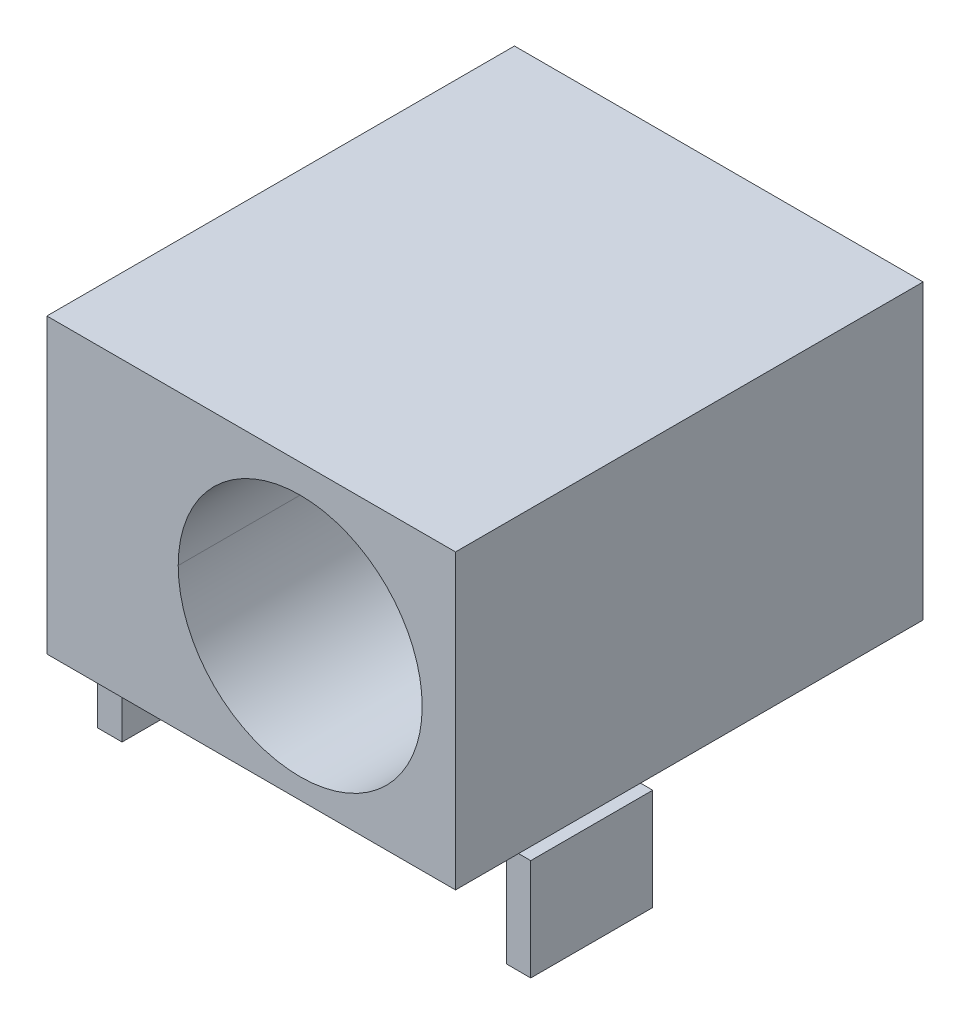
ISO-10303-21;
HEADER;
FILE_DESCRIPTION(('STEP AP214'),'2;1');
FILE_NAME('part.step','',(''),(''),'','','');
FILE_SCHEMA(('AUTOMOTIVE_DESIGN { 1 0 10303 214 1 1 1 1 }'));
ENDSEC;
DATA;
#1=APPLICATION_CONTEXT('core data for automotive mechanical design processes');
#2=APPLICATION_PROTOCOL_DEFINITION('international standard','automotive_design',2000,#1);
#3=PRODUCT_CONTEXT('',#1,'mechanical');
#4=PRODUCT('Part','Part','',(#3));
#5=PRODUCT_RELATED_PRODUCT_CATEGORY('part','',(#4));
#6=PRODUCT_DEFINITION_FORMATION('','',#4);
#7=PRODUCT_DEFINITION_CONTEXT('part definition',#1,'design');
#8=PRODUCT_DEFINITION('design','',#6,#7);
#9=PRODUCT_DEFINITION_SHAPE('','',#8);
#10=(LENGTH_UNIT() NAMED_UNIT(*) SI_UNIT(.MILLI.,.METRE.));
#11=(NAMED_UNIT(*) PLANE_ANGLE_UNIT() SI_UNIT($,.RADIAN.));
#12=(NAMED_UNIT(*) SI_UNIT($,.STERADIAN.) SOLID_ANGLE_UNIT());
#13=UNCERTAINTY_MEASURE_WITH_UNIT(LENGTH_MEASURE(1.E-05),#10,'distance_accuracy_value','');
#14=(GEOMETRIC_REPRESENTATION_CONTEXT(3) GLOBAL_UNCERTAINTY_ASSIGNED_CONTEXT((#13)) GLOBAL_UNIT_ASSIGNED_CONTEXT((#10,
#11,#12)) REPRESENTATION_CONTEXT('',''));
#15=CARTESIAN_POINT('',(0.,0.,0.));
#16=DIRECTION('',(0.,0.,1.));
#17=DIRECTION('',(1.,0.,0.));
#18=AXIS2_PLACEMENT_3D('',#15,#16,#17);
#19=CARTESIAN_POINT('',(0.,0.,-2.45));
#20=DIRECTION('',(0.,0.,-1.));
#21=DIRECTION('',(0.,-1.,0.));
#22=AXIS2_PLACEMENT_3D('',#19,#20,#21);
#23=PLANE('',#22);
#24=CARTESIAN_POINT('',(1.205,3.5,-2.45));
#25=DIRECTION('',(0.,0.,1.));
#26=DIRECTION('',(1.,0.,0.));
#27=AXIS2_PLACEMENT_3D('',#24,#25,#26);
#28=CIRCLE('',#27,3.);
#29=CARTESIAN_POINT('',(-1.795,3.5,-2.45));
#30=VERTEX_POINT('',#29);
#31=CARTESIAN_POINT('',(4.205,3.5,-2.45));
#32=VERTEX_POINT('',#31);
#33=EDGE_CURVE('E274',#30,#32,#28,.T.);
#34=ORIENTED_EDGE('',*,*,#33,.T.);
#35=CARTESIAN_POINT('',(1.205,3.5,-2.45));
#36=DIRECTION('',(0.,0.,1.));
#37=DIRECTION('',(1.,0.,0.));
#38=AXIS2_PLACEMENT_3D('',#35,#36,#37);
#39=CIRCLE('',#38,3.);
#40=EDGE_CURVE('E11',#32,#30,#39,.T.);
#41=ORIENTED_EDGE('',*,*,#40,.T.);
#42=EDGE_LOOP('',(#34,#41));
#43=FACE_BOUND('',#42,.T.);
#44=ADVANCED_FACE('F16',(#43),#23,.F.);
#45=CARTESIAN_POINT('',(1.205,3.5,5.75));
#46=DIRECTION('',(0.,0.,-1.));
#47=DIRECTION('',(-1.,0.,0.));
#48=AXIS2_PLACEMENT_3D('',#45,#46,#47);
#49=CYLINDRICAL_SURFACE('',#48,3.);
#50=DIRECTION('',(0.,0.,-1.));
#51=VECTOR('',#50,1.);
#52=CARTESIAN_POINT('',(4.205,3.5,5.75));
#53=LINE('',#52,#51);
#54=CARTESIAN_POINT('',(4.205,3.5,5.75));
#55=VERTEX_POINT('',#54);
#56=EDGE_CURVE('E279',#55,#32,#53,.T.);
#57=ORIENTED_EDGE('',*,*,#56,.F.);
#58=CARTESIAN_POINT('',(1.205,3.5,5.75));
#59=DIRECTION('',(0.,0.,1.));
#60=DIRECTION('',(1.,0.,0.));
#61=AXIS2_PLACEMENT_3D('',#58,#59,#60);
#62=CIRCLE('',#61,3.);
#63=CARTESIAN_POINT('',(-1.795,3.5,5.75));
#64=VERTEX_POINT('',#63);
#65=EDGE_CURVE('E222',#55,#64,#62,.T.);
#66=ORIENTED_EDGE('',*,*,#65,.T.);
#67=DIRECTION('',(0.,0.,-1.));
#68=VECTOR('',#67,1.);
#69=CARTESIAN_POINT('',(-1.795,3.5,5.75));
#70=LINE('',#69,#68);
#71=EDGE_CURVE('E278',#64,#30,#70,.T.);
#72=ORIENTED_EDGE('',*,*,#71,.T.);
#73=ORIENTED_EDGE('',*,*,#40,.F.);
#74=EDGE_LOOP('',(#57,#66,#72,#73));
#75=FACE_BOUND('',#74,.T.);
#76=ADVANCED_FACE('F409',(#75),#49,.F.);
#77=CARTESIAN_POINT('',(0.,0.,0.));
#78=DIRECTION('',(0.,1.,0.));
#79=DIRECTION('',(1.,0.,0.));
#80=AXIS2_PLACEMENT_3D('',#77,#78,#79);
#81=PLANE('',#80);
#82=DIRECTION('',(1.,0.,0.));
#83=VECTOR('',#82,1.);
#84=CARTESIAN_POINT('',(0.,0.,1.2));
#85=LINE('',#84,#83);
#86=CARTESIAN_POINT('',(5.025,0.,1.2));
#87=VERTEX_POINT('',#86);
#88=CARTESIAN_POINT('',(5.325,0.,1.2));
#89=VERTEX_POINT('',#88);
#90=EDGE_CURVE('E101',#87,#89,#85,.T.);
#91=ORIENTED_EDGE('',*,*,#90,.F.);
#92=DIRECTION('',(0.,0.,1.));
#93=VECTOR('',#92,1.);
#94=CARTESIAN_POINT('',(5.025,0.,0.));
#95=LINE('',#94,#93);
#96=CARTESIAN_POINT('',(5.025,0.,4.2));
#97=VERTEX_POINT('',#96);
#98=EDGE_CURVE('E249',#87,#97,#95,.T.);
#99=ORIENTED_EDGE('',*,*,#98,.T.);
#100=DIRECTION('',(1.,0.,0.));
#101=VECTOR('',#100,1.);
#102=CARTESIAN_POINT('',(0.,0.,4.2));
#103=LINE('',#102,#101);
#104=CARTESIAN_POINT('',(5.325,0.,4.2));
#105=VERTEX_POINT('',#104);
#106=EDGE_CURVE('E27',#97,#105,#103,.T.);
#107=ORIENTED_EDGE('',*,*,#106,.T.);
#108=DIRECTION('',(0.,0.,1.));
#109=VECTOR('',#108,1.);
#110=CARTESIAN_POINT('',(5.325,0.,0.));
#111=LINE('',#110,#109);
#112=EDGE_CURVE('E298',#89,#105,#111,.T.);
#113=ORIENTED_EDGE('',*,*,#112,.F.);
#114=EDGE_LOOP('',(#91,#99,#107,#113));
#115=FACE_BOUND('',#114,.T.);
#116=ADVANCED_FACE('F384',(#115),#81,.T.);
#117=CARTESIAN_POINT('',(0.,-2.5,0.));
#118=DIRECTION('',(0.,1.,0.));
#119=DIRECTION('',(1.,0.,0.));
#120=AXIS2_PLACEMENT_3D('',#117,#118,#119);
#121=PLANE('',#120);
#122=DIRECTION('',(0.,0.,1.));
#123=VECTOR('',#122,1.);
#124=CARTESIAN_POINT('',(4.725,-2.5,0.));
#125=LINE('',#124,#123);
#126=CARTESIAN_POINT('',(4.725,-2.5,1.2));
#127=VERTEX_POINT('',#126);
#128=CARTESIAN_POINT('',(4.725,-2.5,4.2));
#129=VERTEX_POINT('',#128);
#130=EDGE_CURVE('E248',#127,#129,#125,.T.);
#131=ORIENTED_EDGE('',*,*,#130,.F.);
#132=DIRECTION('',(1.,0.,0.));
#133=VECTOR('',#132,1.);
#134=CARTESIAN_POINT('',(0.,-2.5,1.2));
#135=LINE('',#134,#133);
#136=CARTESIAN_POINT('',(5.325,-2.5,1.2));
#137=VERTEX_POINT('',#136);
#138=EDGE_CURVE('E294',#127,#137,#135,.T.);
#139=ORIENTED_EDGE('',*,*,#138,.T.);
#140=DIRECTION('',(0.,0.,1.));
#141=VECTOR('',#140,1.);
#142=CARTESIAN_POINT('',(5.325,-2.5,0.));
#143=LINE('',#142,#141);
#144=CARTESIAN_POINT('',(5.325,-2.5,4.2));
#145=VERTEX_POINT('',#144);
#146=EDGE_CURVE('E303',#137,#145,#143,.T.);
#147=ORIENTED_EDGE('',*,*,#146,.T.);
#148=DIRECTION('',(1.,0.,0.));
#149=VECTOR('',#148,1.);
#150=CARTESIAN_POINT('',(0.,-2.5,4.2));
#151=LINE('',#150,#149);
#152=EDGE_CURVE('E41',#129,#145,#151,.T.);
#153=ORIENTED_EDGE('',*,*,#152,.F.);
#154=EDGE_LOOP('',(#131,#139,#147,#153));
#155=FACE_BOUND('',#154,.T.);
#156=ADVANCED_FACE('F400',(#155),#121,.F.);
#157=CARTESIAN_POINT('',(0.,-2.5,4.2));
#158=DIRECTION('',(0.,0.,1.));
#159=DIRECTION('',(1.,0.,0.));
#160=AXIS2_PLACEMENT_3D('',#157,#158,#159);
#161=PLANE('',#160);
#162=DIRECTION('',(1.,0.,0.));
#163=VECTOR('',#162,1.);
#164=CARTESIAN_POINT('',(0.,0.,4.2));
#165=LINE('',#164,#163);
#166=CARTESIAN_POINT('',(4.725,0.,4.2));
#167=VERTEX_POINT('',#166);
#168=EDGE_CURVE('E256',#167,#97,#165,.T.);
#169=ORIENTED_EDGE('',*,*,#168,.F.);
#170=DIRECTION('',(0.,1.,0.));
#171=VECTOR('',#170,1.);
#172=CARTESIAN_POINT('',(4.725,-2.5,4.2));
#173=LINE('',#172,#171);
#174=EDGE_CURVE('E87',#129,#167,#173,.T.);
#175=ORIENTED_EDGE('',*,*,#174,.F.);
#176=ORIENTED_EDGE('',*,*,#152,.T.);
#177=DIRECTION('',(0.,1.,0.));
#178=VECTOR('',#177,1.);
#179=CARTESIAN_POINT('',(5.325,-2.5,4.2));
#180=LINE('',#179,#178);
#181=EDGE_CURVE('E302',#145,#105,#180,.T.);
#182=ORIENTED_EDGE('',*,*,#181,.T.);
#183=ORIENTED_EDGE('',*,*,#106,.F.);
#184=EDGE_LOOP('',(#169,#175,#176,#182,#183));
#185=FACE_BOUND('',#184,.T.);
#186=ADVANCED_FACE('F387',(#185),#161,.T.);
#187=CARTESIAN_POINT('',(5.325,-2.5,0.));
#188=DIRECTION('',(-1.,0.,0.));
#189=DIRECTION('',(0.,0.,1.));
#190=AXIS2_PLACEMENT_3D('',#187,#188,#189);
#191=PLANE('',#190);
#192=ORIENTED_EDGE('',*,*,#112,.T.);
#193=ORIENTED_EDGE('',*,*,#181,.F.);
#194=ORIENTED_EDGE('',*,*,#146,.F.);
#195=DIRECTION('',(0.,1.,0.));
#196=VECTOR('',#195,1.);
#197=CARTESIAN_POINT('',(5.325,-2.5,1.2));
#198=LINE('',#197,#196);
#199=EDGE_CURVE('E251',#137,#89,#198,.T.);
#200=ORIENTED_EDGE('',*,*,#199,.T.);
#201=EDGE_LOOP('',(#192,#193,#194,#200));
#202=FACE_BOUND('',#201,.T.);
#203=ADVANCED_FACE('F389',(#202),#191,.F.);
#204=CARTESIAN_POINT('',(0.,-2.5,1.2));
#205=DIRECTION('',(0.,0.,1.));
#206=DIRECTION('',(1.,0.,0.));
#207=AXIS2_PLACEMENT_3D('',#204,#205,#206);
#208=PLANE('',#207);
#209=DIRECTION('',(1.,0.,0.));
#210=VECTOR('',#209,1.);
#211=CARTESIAN_POINT('',(0.,0.,1.2));
#212=LINE('',#211,#210);
#213=CARTESIAN_POINT('',(4.725,0.,1.2));
#214=VERTEX_POINT('',#213);
#215=EDGE_CURVE('E280',#214,#87,#212,.T.);
#216=ORIENTED_EDGE('',*,*,#215,.T.);
#217=ORIENTED_EDGE('',*,*,#90,.T.);
#218=ORIENTED_EDGE('',*,*,#199,.F.);
#219=ORIENTED_EDGE('',*,*,#138,.F.);
#220=DIRECTION('',(0.,1.,0.));
#221=VECTOR('',#220,1.);
#222=CARTESIAN_POINT('',(4.725,-2.5,1.2));
#223=LINE('',#222,#221);
#224=EDGE_CURVE('E245',#127,#214,#223,.T.);
#225=ORIENTED_EDGE('',*,*,#224,.T.);
#226=EDGE_LOOP('',(#216,#217,#218,#219,#225));
#227=FACE_BOUND('',#226,.T.);
#228=ADVANCED_FACE('F392',(#227),#208,.F.);
#229=CARTESIAN_POINT('',(4.725,-2.5,0.));
#230=DIRECTION('',(-1.,0.,0.));
#231=DIRECTION('',(0.,0.,1.));
#232=AXIS2_PLACEMENT_3D('',#229,#230,#231);
#233=PLANE('',#232);
#234=DIRECTION('',(0.,0.,1.));
#235=VECTOR('',#234,1.);
#236=CARTESIAN_POINT('',(4.725,0.,0.));
#237=LINE('',#236,#235);
#238=EDGE_CURVE('E283',#214,#167,#237,.T.);
#239=ORIENTED_EDGE('',*,*,#238,.F.);
#240=ORIENTED_EDGE('',*,*,#224,.F.);
#241=ORIENTED_EDGE('',*,*,#130,.T.);
#242=ORIENTED_EDGE('',*,*,#174,.T.);
#243=EDGE_LOOP('',(#239,#240,#241,#242));
#244=FACE_BOUND('',#243,.T.);
#245=ADVANCED_FACE('F398',(#244),#233,.T.);
#246=CARTESIAN_POINT('',(0.,7.2,0.));
#247=DIRECTION('',(0.,1.,0.));
#248=DIRECTION('',(1.,0.,0.));
#249=AXIS2_PLACEMENT_3D('',#246,#247,#248);
#250=PLANE('',#249);
#251=DIRECTION('',(1.,0.,0.));
#252=VECTOR('',#251,1.);
#253=CARTESIAN_POINT('',(0.,7.2,-5.75));
#254=LINE('',#253,#252);
#255=CARTESIAN_POINT('',(-5.025,7.2,-5.75));
#256=VERTEX_POINT('',#255);
#257=CARTESIAN_POINT('',(5.025,7.2,-5.75));
#258=VERTEX_POINT('',#257);
#259=EDGE_CURVE('E234',#256,#258,#254,.T.);
#260=ORIENTED_EDGE('',*,*,#259,.F.);
#261=DIRECTION('',(0.,0.,1.));
#262=VECTOR('',#261,1.);
#263=CARTESIAN_POINT('',(-5.025,7.2,0.));
#264=LINE('',#263,#262);
#265=CARTESIAN_POINT('',(-5.025,7.2,5.75));
#266=VERTEX_POINT('',#265);
#267=EDGE_CURVE('E225',#256,#266,#264,.T.);
#268=ORIENTED_EDGE('',*,*,#267,.T.);
#269=DIRECTION('',(1.,0.,0.));
#270=VECTOR('',#269,1.);
#271=CARTESIAN_POINT('',(0.,7.2,5.75));
#272=LINE('',#271,#270);
#273=CARTESIAN_POINT('',(5.025,7.2,5.75));
#274=VERTEX_POINT('',#273);
#275=EDGE_CURVE('E270',#266,#274,#272,.T.);
#276=ORIENTED_EDGE('',*,*,#275,.T.);
#277=DIRECTION('',(0.,0.,1.));
#278=VECTOR('',#277,1.);
#279=CARTESIAN_POINT('',(5.025,7.2,0.));
#280=LINE('',#279,#278);
#281=EDGE_CURVE('E271',#258,#274,#280,.T.);
#282=ORIENTED_EDGE('',*,*,#281,.F.);
#283=EDGE_LOOP('',(#260,#268,#276,#282));
#284=FACE_BOUND('',#283,.T.);
#285=ADVANCED_FACE('F421',(#284),#250,.T.);
#286=CARTESIAN_POINT('',(5.025,7.2,0.));
#287=DIRECTION('',(1.,0.,0.));
#288=DIRECTION('',(0.,0.,-1.));
#289=AXIS2_PLACEMENT_3D('',#286,#287,#288);
#290=PLANE('',#289);
#291=DIRECTION('',(0.,0.,1.));
#292=VECTOR('',#291,1.);
#293=CARTESIAN_POINT('',(5.025,0.,0.));
#294=LINE('',#293,#292);
#295=CARTESIAN_POINT('',(5.025,0.,-5.75));
#296=VERTEX_POINT('',#295);
#297=EDGE_CURVE('E226',#296,#87,#294,.T.);
#298=ORIENTED_EDGE('',*,*,#297,.F.);
#299=DIRECTION('',(0.,-1.,0.));
#300=VECTOR('',#299,1.);
#301=CARTESIAN_POINT('',(5.025,7.2,-5.75));
#302=LINE('',#301,#300);
#303=EDGE_CURVE('E153',#258,#296,#302,.T.);
#304=ORIENTED_EDGE('',*,*,#303,.F.);
#305=ORIENTED_EDGE('',*,*,#281,.T.);
#306=DIRECTION('',(0.,-1.,0.));
#307=VECTOR('',#306,1.);
#308=CARTESIAN_POINT('',(5.025,7.2,5.75));
#309=LINE('',#308,#307);
#310=CARTESIAN_POINT('',(5.025,0.,5.75));
#311=VERTEX_POINT('',#310);
#312=EDGE_CURVE('E224',#274,#311,#309,.T.);
#313=ORIENTED_EDGE('',*,*,#312,.T.);
#314=DIRECTION('',(0.,0.,1.));
#315=VECTOR('',#314,1.);
#316=CARTESIAN_POINT('',(5.025,0.,0.));
#317=LINE('',#316,#315);
#318=EDGE_CURVE('E244',#97,#311,#317,.T.);
#319=ORIENTED_EDGE('',*,*,#318,.F.);
#320=ORIENTED_EDGE('',*,*,#98,.F.);
#321=EDGE_LOOP('',(#298,#304,#305,#313,#319,#320));
#322=FACE_BOUND('',#321,.T.);
#323=ADVANCED_FACE('F395',(#322),#290,.T.);
#324=CARTESIAN_POINT('',(0.,7.2,5.75));
#325=DIRECTION('',(0.,0.,-1.));
#326=DIRECTION('',(0.,-1.,0.));
#327=AXIS2_PLACEMENT_3D('',#324,#325,#326);
#328=PLANE('',#327);
#329=DIRECTION('',(1.,0.,0.));
#330=VECTOR('',#329,1.);
#331=CARTESIAN_POINT('',(0.,0.,5.75));
#332=LINE('',#331,#330);
#333=CARTESIAN_POINT('',(-5.025,0.,5.75));
#334=VERTEX_POINT('',#333);
#335=EDGE_CURVE('E239',#334,#311,#332,.T.);
#336=ORIENTED_EDGE('',*,*,#335,.T.);
#337=ORIENTED_EDGE('',*,*,#312,.F.);
#338=ORIENTED_EDGE('',*,*,#275,.F.);
#339=DIRECTION('',(0.,-1.,0.));
#340=VECTOR('',#339,1.);
#341=CARTESIAN_POINT('',(-5.025,7.2,5.75));
#342=LINE('',#341,#340);
#343=EDGE_CURVE('E267',#266,#334,#342,.T.);
#344=ORIENTED_EDGE('',*,*,#343,.T.);
#345=EDGE_LOOP('',(#336,#337,#338,#344));
#346=FACE_BOUND('',#345,.T.);
#347=CARTESIAN_POINT('',(1.205,3.5,5.75));
#348=DIRECTION('',(0.,0.,1.));
#349=DIRECTION('',(1.,0.,0.));
#350=AXIS2_PLACEMENT_3D('',#347,#348,#349);
#351=CIRCLE('',#350,3.);
#352=EDGE_CURVE('E20',#64,#55,#351,.T.);
#353=ORIENTED_EDGE('',*,*,#352,.F.);
#354=ORIENTED_EDGE('',*,*,#65,.F.);
#355=EDGE_LOOP('',(#353,#354));
#356=FACE_BOUND('',#355,.T.);
#357=ADVANCED_FACE('F432',(#346,#356),#328,.F.);
#358=CARTESIAN_POINT('',(-5.025,7.2,0.));
#359=DIRECTION('',(1.,0.,0.));
#360=DIRECTION('',(0.,1.,0.));
#361=AXIS2_PLACEMENT_3D('',#358,#359,#360);
#362=PLANE('',#361);
#363=DIRECTION('',(0.,0.,1.));
#364=VECTOR('',#363,1.);
#365=CARTESIAN_POINT('',(-5.025,0.,0.));
#366=LINE('',#365,#364);
#367=CARTESIAN_POINT('',(-5.025,0.,-5.75));
#368=VERTEX_POINT('',#367);
#369=CARTESIAN_POINT('',(-5.025,0.,1.2));
#370=VERTEX_POINT('',#369);
#371=EDGE_CURVE('E322',#368,#370,#366,.T.);
#372=ORIENTED_EDGE('',*,*,#371,.T.);
#373=DIRECTION('',(0.,0.,1.));
#374=VECTOR('',#373,1.);
#375=CARTESIAN_POINT('',(-5.025,0.,0.));
#376=LINE('',#375,#374);
#377=CARTESIAN_POINT('',(-5.025,0.,4.2));
#378=VERTEX_POINT('',#377);
#379=EDGE_CURVE('E235',#370,#378,#376,.T.);
#380=ORIENTED_EDGE('',*,*,#379,.T.);
#381=DIRECTION('',(0.,0.,1.));
#382=VECTOR('',#381,1.);
#383=CARTESIAN_POINT('',(-5.025,0.,0.));
#384=LINE('',#383,#382);
#385=EDGE_CURVE('E243',#378,#334,#384,.T.);
#386=ORIENTED_EDGE('',*,*,#385,.T.);
#387=ORIENTED_EDGE('',*,*,#343,.F.);
#388=ORIENTED_EDGE('',*,*,#267,.F.);
#389=DIRECTION('',(0.,-1.,0.));
#390=VECTOR('',#389,1.);
#391=CARTESIAN_POINT('',(-5.025,7.2,-5.75));
#392=LINE('',#391,#390);
#393=EDGE_CURVE('E231',#256,#368,#392,.T.);
#394=ORIENTED_EDGE('',*,*,#393,.T.);
#395=EDGE_LOOP('',(#372,#380,#386,#387,#388,#394));
#396=FACE_BOUND('',#395,.T.);
#397=ADVANCED_FACE('F372',(#396),#362,.F.);
#398=CARTESIAN_POINT('',(0.,7.2,-5.75));
#399=DIRECTION('',(0.,0.,-1.));
#400=DIRECTION('',(0.,-1.,0.));
#401=AXIS2_PLACEMENT_3D('',#398,#399,#400);
#402=PLANE('',#401);
#403=DIRECTION('',(1.,0.,0.));
#404=VECTOR('',#403,1.);
#405=CARTESIAN_POINT('',(0.,0.,-5.75));
#406=LINE('',#405,#404);
#407=EDGE_CURVE('E230',#368,#296,#406,.T.);
#408=ORIENTED_EDGE('',*,*,#407,.F.);
#409=ORIENTED_EDGE('',*,*,#393,.F.);
#410=ORIENTED_EDGE('',*,*,#259,.T.);
#411=ORIENTED_EDGE('',*,*,#303,.T.);
#412=EDGE_LOOP('',(#408,#409,#410,#411));
#413=FACE_BOUND('',#412,.T.);
#414=ADVANCED_FACE('F431',(#413),#402,.T.);
#415=CARTESIAN_POINT('',(0.,0.,0.));
#416=DIRECTION('',(0.,1.,0.));
#417=DIRECTION('',(1.,0.,0.));
#418=AXIS2_PLACEMENT_3D('',#415,#416,#417);
#419=PLANE('',#418);
#420=ORIENTED_EDGE('',*,*,#379,.F.);
#421=DIRECTION('',(-1.,0.,0.));
#422=VECTOR('',#421,1.);
#423=CARTESIAN_POINT('',(0.,0.,1.2));
#424=LINE('',#423,#422);
#425=CARTESIAN_POINT('',(-5.325,0.,1.2));
#426=VERTEX_POINT('',#425);
#427=EDGE_CURVE('E198',#370,#426,#424,.T.);
#428=ORIENTED_EDGE('',*,*,#427,.T.);
#429=DIRECTION('',(0.,0.,1.));
#430=VECTOR('',#429,1.);
#431=CARTESIAN_POINT('',(-5.325,0.,0.));
#432=LINE('',#431,#430);
#433=CARTESIAN_POINT('',(-5.325,0.,4.2));
#434=VERTEX_POINT('',#433);
#435=EDGE_CURVE('E141',#426,#434,#432,.T.);
#436=ORIENTED_EDGE('',*,*,#435,.T.);
#437=DIRECTION('',(-1.,0.,0.));
#438=VECTOR('',#437,1.);
#439=CARTESIAN_POINT('',(0.,0.,4.2));
#440=LINE('',#439,#438);
#441=EDGE_CURVE('E220',#378,#434,#440,.T.);
#442=ORIENTED_EDGE('',*,*,#441,.F.);
#443=EDGE_LOOP('',(#420,#428,#436,#442));
#444=FACE_BOUND('',#443,.T.);
#445=ADVANCED_FACE('F374',(#444),#419,.T.);
#446=CARTESIAN_POINT('',(0.,-2.5,0.));
#447=DIRECTION('',(0.,1.,0.));
#448=DIRECTION('',(1.,0.,0.));
#449=AXIS2_PLACEMENT_3D('',#446,#447,#448);
#450=PLANE('',#449);
#451=DIRECTION('',(-1.,0.,0.));
#452=VECTOR('',#451,1.);
#453=CARTESIAN_POINT('',(0.,-2.5,4.2));
#454=LINE('',#453,#452);
#455=CARTESIAN_POINT('',(-4.725,-2.5,4.2));
#456=VERTEX_POINT('',#455);
#457=CARTESIAN_POINT('',(-5.325,-2.5,4.2));
#458=VERTEX_POINT('',#457);
#459=EDGE_CURVE('E204',#456,#458,#454,.T.);
#460=ORIENTED_EDGE('',*,*,#459,.T.);
#461=DIRECTION('',(0.,0.,1.));
#462=VECTOR('',#461,1.);
#463=CARTESIAN_POINT('',(-5.325,-2.5,0.));
#464=LINE('',#463,#462);
#465=CARTESIAN_POINT('',(-5.325,-2.5,1.2));
#466=VERTEX_POINT('',#465);
#467=EDGE_CURVE('E201',#466,#458,#464,.T.);
#468=ORIENTED_EDGE('',*,*,#467,.F.);
#469=DIRECTION('',(-1.,0.,0.));
#470=VECTOR('',#469,1.);
#471=CARTESIAN_POINT('',(0.,-2.5,1.2));
#472=LINE('',#471,#470);
#473=CARTESIAN_POINT('',(-4.725,-2.5,1.2));
#474=VERTEX_POINT('',#473);
#475=EDGE_CURVE('E188',#474,#466,#472,.T.);
#476=ORIENTED_EDGE('',*,*,#475,.F.);
#477=DIRECTION('',(0.,0.,1.));
#478=VECTOR('',#477,1.);
#479=CARTESIAN_POINT('',(-4.725,-2.5,0.));
#480=LINE('',#479,#478);
#481=EDGE_CURVE('E236',#474,#456,#480,.T.);
#482=ORIENTED_EDGE('',*,*,#481,.T.);
#483=EDGE_LOOP('',(#460,#468,#476,#482));
#484=FACE_BOUND('',#483,.T.);
#485=ADVANCED_FACE('F202',(#484),#450,.F.);
#486=CARTESIAN_POINT('',(-4.725,-2.5,0.));
#487=DIRECTION('',(-1.,0.,0.));
#488=DIRECTION('',(0.,0.,1.));
#489=AXIS2_PLACEMENT_3D('',#486,#487,#488);
#490=PLANE('',#489);
#491=DIRECTION('',(0.,0.,1.));
#492=VECTOR('',#491,1.);
#493=CARTESIAN_POINT('',(-4.725,0.,0.));
#494=LINE('',#493,#492);
#495=CARTESIAN_POINT('',(-4.725,0.,1.2));
#496=VERTEX_POINT('',#495);
#497=CARTESIAN_POINT('',(-4.725,0.,4.2));
#498=VERTEX_POINT('',#497);
#499=EDGE_CURVE('E323',#496,#498,#494,.T.);
#500=ORIENTED_EDGE('',*,*,#499,.T.);
#501=DIRECTION('',(0.,1.,0.));
#502=VECTOR('',#501,1.);
#503=CARTESIAN_POINT('',(-4.725,-2.5,4.2));
#504=LINE('',#503,#502);
#505=EDGE_CURVE('E216',#456,#498,#504,.T.);
#506=ORIENTED_EDGE('',*,*,#505,.F.);
#507=ORIENTED_EDGE('',*,*,#481,.F.);
#508=DIRECTION('',(0.,1.,0.));
#509=VECTOR('',#508,1.);
#510=CARTESIAN_POINT('',(-4.725,-2.5,1.2));
#511=LINE('',#510,#509);
#512=EDGE_CURVE('E195',#474,#496,#511,.T.);
#513=ORIENTED_EDGE('',*,*,#512,.T.);
#514=EDGE_LOOP('',(#500,#506,#507,#513));
#515=FACE_BOUND('',#514,.T.);
#516=ADVANCED_FACE('F365',(#515),#490,.F.);
#517=CARTESIAN_POINT('',(0.,-2.5,1.2));
#518=DIRECTION('',(0.,0.,-1.));
#519=DIRECTION('',(0.,-1.,0.));
#520=AXIS2_PLACEMENT_3D('',#517,#518,#519);
#521=PLANE('',#520);
#522=DIRECTION('',(-1.,0.,0.));
#523=VECTOR('',#522,1.);
#524=CARTESIAN_POINT('',(0.,0.,1.2));
#525=LINE('',#524,#523);
#526=EDGE_CURVE('E318',#496,#370,#525,.T.);
#527=ORIENTED_EDGE('',*,*,#526,.F.);
#528=ORIENTED_EDGE('',*,*,#512,.F.);
#529=ORIENTED_EDGE('',*,*,#475,.T.);
#530=DIRECTION('',(0.,1.,0.));
#531=VECTOR('',#530,1.);
#532=CARTESIAN_POINT('',(-5.325,-2.5,1.2));
#533=LINE('',#532,#531);
#534=EDGE_CURVE('E194',#466,#426,#533,.T.);
#535=ORIENTED_EDGE('',*,*,#534,.T.);
#536=ORIENTED_EDGE('',*,*,#427,.F.);
#537=EDGE_LOOP('',(#527,#528,#529,#535,#536));
#538=FACE_BOUND('',#537,.T.);
#539=ADVANCED_FACE('F191',(#538),#521,.T.);
#540=CARTESIAN_POINT('',(-5.325,-2.5,0.));
#541=DIRECTION('',(-1.,0.,0.));
#542=DIRECTION('',(0.,0.,1.));
#543=AXIS2_PLACEMENT_3D('',#540,#541,#542);
#544=PLANE('',#543);
#545=ORIENTED_EDGE('',*,*,#435,.F.);
#546=ORIENTED_EDGE('',*,*,#534,.F.);
#547=ORIENTED_EDGE('',*,*,#467,.T.);
#548=DIRECTION('',(0.,1.,0.));
#549=VECTOR('',#548,1.);
#550=CARTESIAN_POINT('',(-5.325,-2.5,4.2));
#551=LINE('',#550,#549);
#552=EDGE_CURVE('E289',#458,#434,#551,.T.);
#553=ORIENTED_EDGE('',*,*,#552,.T.);
#554=EDGE_LOOP('',(#545,#546,#547,#553));
#555=FACE_BOUND('',#554,.T.);
#556=ADVANCED_FACE('F209',(#555),#544,.T.);
#557=CARTESIAN_POINT('',(0.,-2.5,4.2));
#558=DIRECTION('',(0.,0.,-1.));
#559=DIRECTION('',(-1.,0.,0.));
#560=AXIS2_PLACEMENT_3D('',#557,#558,#559);
#561=PLANE('',#560);
#562=DIRECTION('',(-1.,0.,0.));
#563=VECTOR('',#562,1.);
#564=CARTESIAN_POINT('',(0.,0.,4.2));
#565=LINE('',#564,#563);
#566=EDGE_CURVE('E263',#498,#378,#565,.T.);
#567=ORIENTED_EDGE('',*,*,#566,.T.);
#568=ORIENTED_EDGE('',*,*,#441,.T.);
#569=ORIENTED_EDGE('',*,*,#552,.F.);
#570=ORIENTED_EDGE('',*,*,#459,.F.);
#571=ORIENTED_EDGE('',*,*,#505,.T.);
#572=EDGE_LOOP('',(#567,#568,#569,#570,#571));
#573=FACE_BOUND('',#572,.T.);
#574=ADVANCED_FACE('F359',(#573),#561,.F.);
#575=CARTESIAN_POINT('',(0.,0.,0.));
#576=DIRECTION('',(0.,1.,0.));
#577=DIRECTION('',(1.,0.,0.));
#578=AXIS2_PLACEMENT_3D('',#575,#576,#577);
#579=PLANE('',#578);
#580=ORIENTED_EDGE('',*,*,#215,.F.);
#581=ORIENTED_EDGE('',*,*,#238,.T.);
#582=ORIENTED_EDGE('',*,*,#168,.T.);
#583=ORIENTED_EDGE('',*,*,#318,.T.);
#584=ORIENTED_EDGE('',*,*,#335,.F.);
#585=ORIENTED_EDGE('',*,*,#385,.F.);
#586=ORIENTED_EDGE('',*,*,#566,.F.);
#587=ORIENTED_EDGE('',*,*,#499,.F.);
#588=ORIENTED_EDGE('',*,*,#526,.T.);
#589=ORIENTED_EDGE('',*,*,#371,.F.);
#590=ORIENTED_EDGE('',*,*,#407,.T.);
#591=ORIENTED_EDGE('',*,*,#297,.T.);
#592=EDGE_LOOP('',(#580,#581,#582,#583,#584,#585,#586,#587,#588,#589,#590,#591));
#593=FACE_BOUND('',#592,.T.);
#594=ADVANCED_FACE('F368',(#593),#579,.F.);
#595=CARTESIAN_POINT('',(1.205,3.5,5.75));
#596=DIRECTION('',(0.,0.,-1.));
#597=DIRECTION('',(-1.,0.,0.));
#598=AXIS2_PLACEMENT_3D('',#595,#596,#597);
#599=CYLINDRICAL_SURFACE('',#598,3.);
#600=ORIENTED_EDGE('',*,*,#352,.T.);
#601=ORIENTED_EDGE('',*,*,#56,.T.);
#602=ORIENTED_EDGE('',*,*,#33,.F.);
#603=ORIENTED_EDGE('',*,*,#71,.F.);
#604=EDGE_LOOP('',(#600,#601,#602,#603));
#605=FACE_BOUND('',#604,.T.);
#606=ADVANCED_FACE('F18',(#605),#599,.F.);
#607=CLOSED_SHELL('',(#44,#76,#116,#156,#186,#203,#228,#245,#285,#323,#357,#397,#414,#445,#485,
#516,#539,#556,#574,#594,#606));
#608=MANIFOLD_SOLID_BREP('B1',#607);
#609=ADVANCED_BREP_SHAPE_REPRESENTATION('',(#18,#608),#14);
#610=SHAPE_DEFINITION_REPRESENTATION(#9,#609);
ENDSEC;
END-ISO-10303-21;
